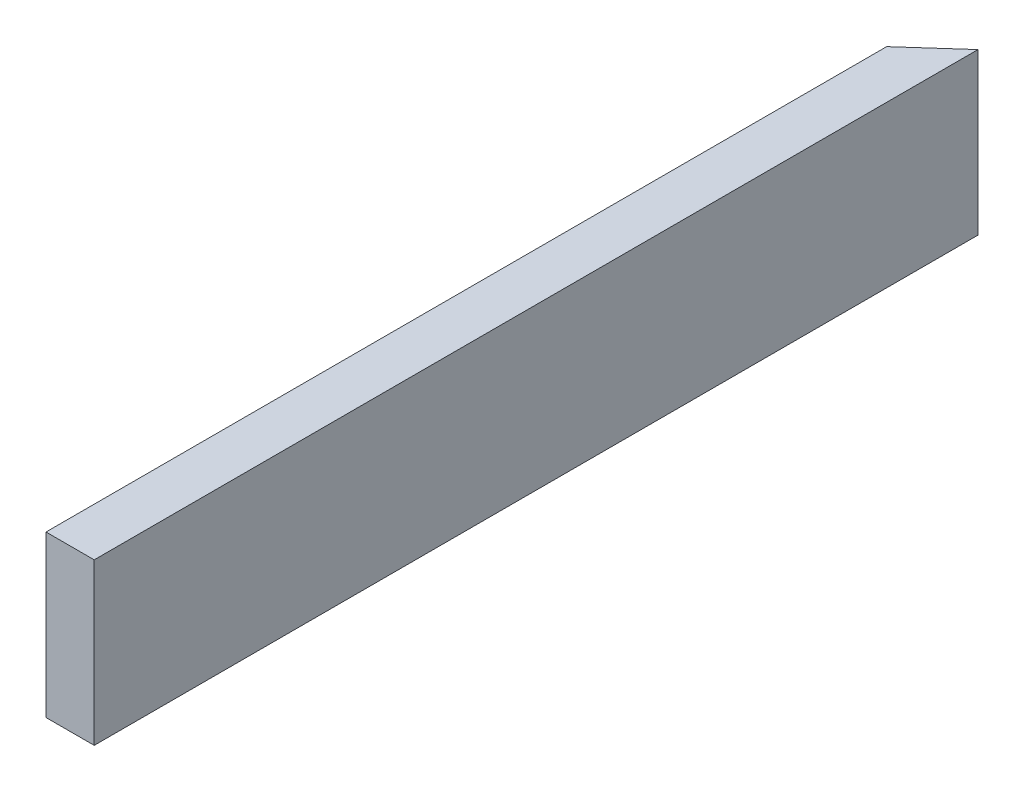
ISO-10303-21;
HEADER;
FILE_DESCRIPTION(('STEP AP214'),'2;1');
FILE_NAME('part.step','',(''),(''),'','','');
FILE_SCHEMA(('AUTOMOTIVE_DESIGN { 1 0 10303 214 1 1 1 1 }'));
ENDSEC;
DATA;
#1=APPLICATION_CONTEXT('core data for automotive mechanical design processes');
#2=APPLICATION_PROTOCOL_DEFINITION('international standard','automotive_design',2000,#1);
#3=PRODUCT_CONTEXT('',#1,'mechanical');
#4=PRODUCT('Part','Part','',(#3));
#5=PRODUCT_RELATED_PRODUCT_CATEGORY('part','',(#4));
#6=PRODUCT_DEFINITION_FORMATION('','',#4);
#7=PRODUCT_DEFINITION_CONTEXT('part definition',#1,'design');
#8=PRODUCT_DEFINITION('design','',#6,#7);
#9=PRODUCT_DEFINITION_SHAPE('','',#8);
#10=(LENGTH_UNIT() NAMED_UNIT(*) SI_UNIT(.MILLI.,.METRE.));
#11=(NAMED_UNIT(*) PLANE_ANGLE_UNIT() SI_UNIT($,.RADIAN.));
#12=(NAMED_UNIT(*) SI_UNIT($,.STERADIAN.) SOLID_ANGLE_UNIT());
#13=UNCERTAINTY_MEASURE_WITH_UNIT(LENGTH_MEASURE(1.E-05),#10,'distance_accuracy_value','');
#14=(GEOMETRIC_REPRESENTATION_CONTEXT(3) GLOBAL_UNCERTAINTY_ASSIGNED_CONTEXT((#13)) GLOBAL_UNIT_ASSIGNED_CONTEXT((#10,
#11,#12)) REPRESENTATION_CONTEXT('',''));
#15=CARTESIAN_POINT('',(0.,0.,0.));
#16=DIRECTION('',(0.,0.,1.));
#17=DIRECTION('',(1.,0.,0.));
#18=AXIS2_PLACEMENT_3D('',#15,#16,#17);
#19=CARTESIAN_POINT('',(-3.9032258064516,12.8387096774193,55.));
#20=DIRECTION('',(1.,0.,0.));
#21=DIRECTION('',(0.,1.,0.));
#22=AXIS2_PLACEMENT_3D('',#19,#20,#21);
#23=PLANE('',#22);
#24=DIRECTION('',(0.,0.,-1.));
#25=VECTOR('',#24,1.);
#26=CARTESIAN_POINT('',(-3.9032258064516,12.8387096774193,55.));
#27=LINE('',#26,#25);
#28=CARTESIAN_POINT('',(-3.9032258064516,12.8387096774193,55.));
#29=VERTEX_POINT('',#28);
#30=CARTESIAN_POINT('',(-3.9032258064516,12.8387096774193,2.68230957347922));
#31=VERTEX_POINT('',#30);
#32=EDGE_CURVE('E83',#29,#31,#27,.T.);
#33=ORIENTED_EDGE('',*,*,#32,.T.);
#34=DIRECTION('',(0.,1.,0.));
#35=VECTOR('',#34,1.);
#36=CARTESIAN_POINT('',(-3.9032258064516,-39.1612903225807,2.68230957347922));
#37=LINE('',#36,#35);
#38=CARTESIAN_POINT('',(-3.9032258064516,2.83870967741931,2.68230957347922));
#39=VERTEX_POINT('',#38);
#40=EDGE_CURVE('E69',#39,#31,#37,.T.);
#41=ORIENTED_EDGE('',*,*,#40,.F.);
#42=DIRECTION('',(0.,0.,-1.));
#43=VECTOR('',#42,1.);
#44=CARTESIAN_POINT('',(-3.9032258064516,2.83870967741933,55.));
#45=LINE('',#44,#43);
#46=CARTESIAN_POINT('',(-3.9032258064516,2.83870967741933,55.));
#47=VERTEX_POINT('',#46);
#48=EDGE_CURVE('E11',#47,#39,#45,.T.);
#49=ORIENTED_EDGE('',*,*,#48,.F.);
#50=DIRECTION('',(0.,-1.,0.));
#51=VECTOR('',#50,1.);
#52=CARTESIAN_POINT('',(-3.9032258064516,12.8387096774193,55.));
#53=LINE('',#52,#51);
#54=EDGE_CURVE('E88',#29,#47,#53,.T.);
#55=ORIENTED_EDGE('',*,*,#54,.F.);
#56=EDGE_LOOP('',(#33,#41,#49,#55));
#57=FACE_BOUND('',#56,.T.);
#58=ADVANCED_FACE('F33',(#57),#23,.F.);
#59=CARTESIAN_POINT('',(-3.9032258064516,2.83870967741933,55.));
#60=DIRECTION('',(0.,1.,0.));
#61=DIRECTION('',(0.,0.,1.));
#62=AXIS2_PLACEMENT_3D('',#59,#60,#61);
#63=PLANE('',#62);
#64=ORIENTED_EDGE('',*,*,#48,.T.);
#65=DIRECTION('',(0.745475999682867,0.,-0.666532470249448));
#66=VECTOR('',#65,1.);
#67=CARTESIAN_POINT('',(-29.8990469816775,2.83870967741933,25.9252562430666));
#68=LINE('',#67,#66);
#69=CARTESIAN_POINT('',(-0.9032258064516,2.83870967741931,0.));
#70=VERTEX_POINT('',#69);
#71=EDGE_CURVE('E75',#39,#70,#68,.T.);
#72=ORIENTED_EDGE('',*,*,#71,.T.);
#73=DIRECTION('',(0.,0.,-1.));
#74=VECTOR('',#73,1.);
#75=CARTESIAN_POINT('',(-0.903225806451599,2.83870967741933,55.));
#76=LINE('',#75,#74);
#77=CARTESIAN_POINT('',(-0.903225806451599,2.83870967741933,55.));
#78=VERTEX_POINT('',#77);
#79=EDGE_CURVE('E41',#78,#70,#76,.T.);
#80=ORIENTED_EDGE('',*,*,#79,.F.);
#81=DIRECTION('',(1.,0.,0.));
#82=VECTOR('',#81,1.);
#83=CARTESIAN_POINT('',(-3.9032258064516,2.83870967741933,55.));
#84=LINE('',#83,#82);
#85=EDGE_CURVE('E102',#47,#78,#84,.T.);
#86=ORIENTED_EDGE('',*,*,#85,.F.);
#87=EDGE_LOOP('',(#64,#72,#80,#86));
#88=FACE_BOUND('',#87,.T.);
#89=ADVANCED_FACE('F101',(#88),#63,.F.);
#90=CARTESIAN_POINT('',(-0.9032258064516,12.8387096774193,55.));
#91=DIRECTION('',(-1.,0.,0.));
#92=DIRECTION('',(0.,-1.,0.));
#93=AXIS2_PLACEMENT_3D('',#90,#91,#92);
#94=PLANE('',#93);
#95=DIRECTION('',(0.,1.,0.));
#96=VECTOR('',#95,1.);
#97=CARTESIAN_POINT('',(-0.9032258064516,12.8387096774193,0.));
#98=LINE('',#97,#96);
#99=CARTESIAN_POINT('',(-0.9032258064516,12.8387096774193,0.));
#100=VERTEX_POINT('',#99);
#101=EDGE_CURVE('E94',#70,#100,#98,.T.);
#102=ORIENTED_EDGE('',*,*,#101,.T.);
#103=DIRECTION('',(0.,0.,-1.));
#104=VECTOR('',#103,1.);
#105=CARTESIAN_POINT('',(-0.9032258064516,12.8387096774193,55.));
#106=LINE('',#105,#104);
#107=CARTESIAN_POINT('',(-0.9032258064516,12.8387096774193,55.));
#108=VERTEX_POINT('',#107);
#109=EDGE_CURVE('E86',#108,#100,#106,.T.);
#110=ORIENTED_EDGE('',*,*,#109,.F.);
#111=DIRECTION('',(0.,1.,0.));
#112=VECTOR('',#111,1.);
#113=CARTESIAN_POINT('',(-0.9032258064516,12.8387096774193,55.));
#114=LINE('',#113,#112);
#115=EDGE_CURVE('E91',#78,#108,#114,.T.);
#116=ORIENTED_EDGE('',*,*,#115,.F.);
#117=ORIENTED_EDGE('',*,*,#79,.T.);
#118=EDGE_LOOP('',(#102,#110,#116,#117));
#119=FACE_BOUND('',#118,.T.);
#120=ADVANCED_FACE('F99',(#119),#94,.F.);
#121=CARTESIAN_POINT('',(-3.9032258064516,12.8387096774193,55.));
#122=DIRECTION('',(0.,-1.,0.));
#123=DIRECTION('',(0.,0.,-1.));
#124=AXIS2_PLACEMENT_3D('',#121,#122,#123);
#125=PLANE('',#124);
#126=ORIENTED_EDGE('',*,*,#109,.T.);
#127=DIRECTION('',(0.745475999682867,0.,-0.666532470249448));
#128=VECTOR('',#127,1.);
#129=CARTESIAN_POINT('',(-0.9032258064516,12.8387096774193,0.));
#130=LINE('',#129,#128);
#131=EDGE_CURVE('E72',#31,#100,#130,.T.);
#132=ORIENTED_EDGE('',*,*,#131,.F.);
#133=ORIENTED_EDGE('',*,*,#32,.F.);
#134=DIRECTION('',(-1.,0.,0.));
#135=VECTOR('',#134,1.);
#136=CARTESIAN_POINT('',(-3.9032258064516,12.8387096774193,55.));
#137=LINE('',#136,#135);
#138=EDGE_CURVE('E48',#108,#29,#137,.T.);
#139=ORIENTED_EDGE('',*,*,#138,.F.);
#140=EDGE_LOOP('',(#126,#132,#133,#139));
#141=FACE_BOUND('',#140,.T.);
#142=ADVANCED_FACE('F82',(#141),#125,.F.);
#143=CARTESIAN_POINT('',(0.,0.,55.));
#144=DIRECTION('',(0.,0.,1.));
#145=DIRECTION('',(1.,0.,0.));
#146=AXIS2_PLACEMENT_3D('',#143,#144,#145);
#147=PLANE('',#146);
#148=ORIENTED_EDGE('',*,*,#54,.T.);
#149=ORIENTED_EDGE('',*,*,#85,.T.);
#150=ORIENTED_EDGE('',*,*,#115,.T.);
#151=ORIENTED_EDGE('',*,*,#138,.T.);
#152=EDGE_LOOP('',(#148,#149,#150,#151));
#153=FACE_BOUND('',#152,.T.);
#154=ADVANCED_FACE('F107',(#153),#147,.T.);
#155=CARTESIAN_POINT('',(-0.9032258064516,-39.1612903225807,0.));
#156=DIRECTION('',(0.666532470249447,0.,0.745475999682867));
#157=DIRECTION('',(0.745475999682867,0.,-0.666532470249448));
#158=AXIS2_PLACEMENT_3D('',#155,#156,#157);
#159=PLANE('',#158);
#160=ORIENTED_EDGE('',*,*,#40,.T.);
#161=ORIENTED_EDGE('',*,*,#131,.T.);
#162=ORIENTED_EDGE('',*,*,#101,.F.);
#163=ORIENTED_EDGE('',*,*,#71,.F.);
#164=EDGE_LOOP('',(#160,#161,#162,#163));
#165=FACE_BOUND('',#164,.T.);
#166=ADVANCED_FACE('F71',(#165),#159,.F.);
#167=CLOSED_SHELL('',(#58,#89,#120,#142,#154,#166));
#168=MANIFOLD_SOLID_BREP('B2',#167);
#169=ADVANCED_BREP_SHAPE_REPRESENTATION('',(#18,#168),#14);
#170=SHAPE_DEFINITION_REPRESENTATION(#9,#169);
ENDSEC;
END-ISO-10303-21;
